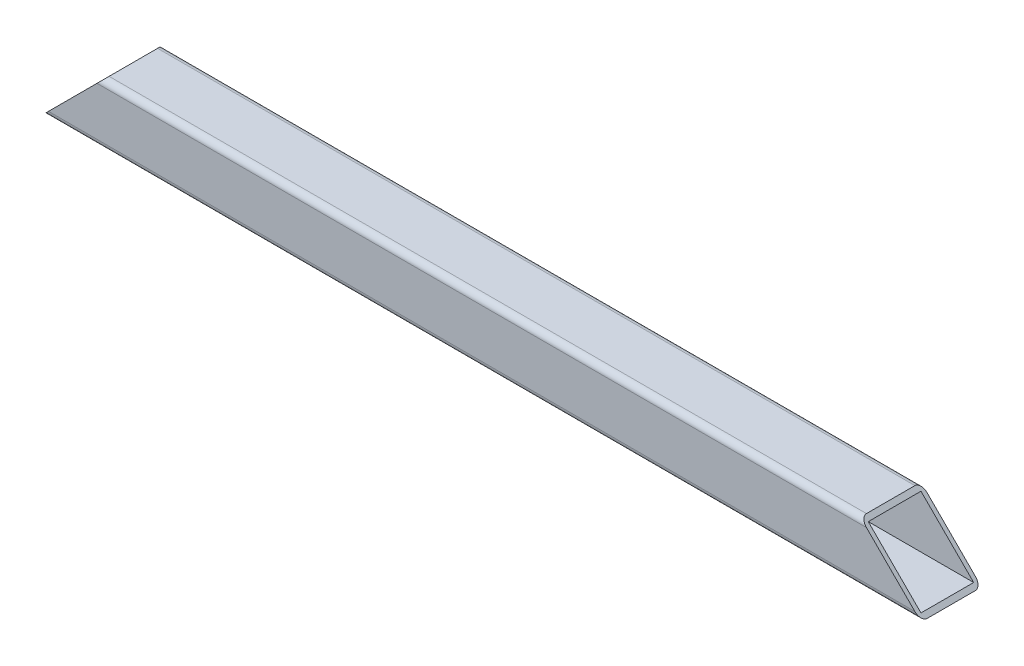
ISO-10303-21;
HEADER;
FILE_DESCRIPTION(('STEP AP214'),'2;1');
FILE_NAME('part.step','',(''),(''),'','','');
FILE_SCHEMA(('AUTOMOTIVE_DESIGN { 1 0 10303 214 1 1 1 1 }'));
ENDSEC;
DATA;
#1=APPLICATION_CONTEXT('core data for automotive mechanical design processes');
#2=APPLICATION_PROTOCOL_DEFINITION('international standard','automotive_design',2000,#1);
#3=PRODUCT_CONTEXT('',#1,'mechanical');
#4=PRODUCT('Part','Part','',(#3));
#5=PRODUCT_RELATED_PRODUCT_CATEGORY('part','',(#4));
#6=PRODUCT_DEFINITION_FORMATION('','',#4);
#7=PRODUCT_DEFINITION_CONTEXT('part definition',#1,'design');
#8=PRODUCT_DEFINITION('design','',#6,#7);
#9=PRODUCT_DEFINITION_SHAPE('','',#8);
#10=(LENGTH_UNIT() NAMED_UNIT(*) SI_UNIT(.MILLI.,.METRE.));
#11=(NAMED_UNIT(*) PLANE_ANGLE_UNIT() SI_UNIT($,.RADIAN.));
#12=(NAMED_UNIT(*) SI_UNIT($,.STERADIAN.) SOLID_ANGLE_UNIT());
#13=UNCERTAINTY_MEASURE_WITH_UNIT(LENGTH_MEASURE(1.E-05),#10,'distance_accuracy_value','');
#14=(GEOMETRIC_REPRESENTATION_CONTEXT(3) GLOBAL_UNCERTAINTY_ASSIGNED_CONTEXT((#13)) GLOBAL_UNIT_ASSIGNED_CONTEXT((#10,
#11,#12)) REPRESENTATION_CONTEXT('',''));
#15=CARTESIAN_POINT('',(0.,0.,0.));
#16=DIRECTION('',(0.,0.,1.));
#17=DIRECTION('',(1.,0.,0.));
#18=AXIS2_PLACEMENT_3D('',#15,#16,#17);
#19=CARTESIAN_POINT('',(-171.45,157.226,1427.861));
#20=DIRECTION('',(0.,-1.,0.));
#21=DIRECTION('',(0.,0.,-1.));
#22=AXIS2_PLACEMENT_3D('',#19,#20,#21);
#23=PLANE('',#22);
#24=DIRECTION('',(0.,0.,-1.));
#25=VECTOR('',#24,1.);
#26=CARTESIAN_POINT('',(-158.75,157.226,1427.861));
#27=LINE('',#26,#25);
#28=CARTESIAN_POINT('',(-158.75,157.226,1450.721));
#29=VERTEX_POINT('',#28);
#30=CARTESIAN_POINT('',(-158.75,157.226,1430.401));
#31=VERTEX_POINT('',#30);
#32=EDGE_CURVE('E256',#29,#31,#27,.T.);
#33=ORIENTED_EDGE('',*,*,#32,.F.);
#34=DIRECTION('',(1.,0.,0.));
#35=VECTOR('',#34,1.);
#36=CARTESIAN_POINT('',(-171.45,157.226,1450.721));
#37=LINE('',#36,#35);
#38=CARTESIAN_POINT('',(158.75,157.226,1450.721));
#39=VERTEX_POINT('',#38);
#40=EDGE_CURVE('E11',#29,#39,#37,.T.);
#41=ORIENTED_EDGE('',*,*,#40,.T.);
#42=DIRECTION('',(0.,0.,1.));
#43=VECTOR('',#42,1.);
#44=CARTESIAN_POINT('',(158.75,157.226,1427.861));
#45=LINE('',#44,#43);
#46=CARTESIAN_POINT('',(158.75,157.226,1430.401));
#47=VERTEX_POINT('',#46);
#48=EDGE_CURVE('E172',#47,#39,#45,.T.);
#49=ORIENTED_EDGE('',*,*,#48,.F.);
#50=DIRECTION('',(1.,0.,0.));
#51=VECTOR('',#50,1.);
#52=CARTESIAN_POINT('',(-171.45,157.226,1430.401));
#53=LINE('',#52,#51);
#54=EDGE_CURVE('E52',#47,#31,#53,.F.);
#55=ORIENTED_EDGE('',*,*,#54,.T.);
#56=EDGE_LOOP('',(#33,#41,#49,#55));
#57=FACE_BOUND('',#56,.T.);
#58=ADVANCED_FACE('F43',(#57),#23,.F.);
#59=CARTESIAN_POINT('',(-171.45,131.826,1427.861));
#60=DIRECTION('',(0.,0.,1.));
#61=DIRECTION('',(1.,0.,0.));
#62=AXIS2_PLACEMENT_3D('',#59,#60,#61);
#63=PLANE('',#62);
#64=DIRECTION('',(-0.707106781186548,0.707106781186548,0.));
#65=VECTOR('',#64,1.);
#66=CARTESIAN_POINT('',(6.34999999999997,309.626,1427.861));
#67=LINE('',#66,#65);
#68=CARTESIAN_POINT('',(181.61,134.366,1427.861));
#69=VERTEX_POINT('',#68);
#70=CARTESIAN_POINT('',(161.29,154.686,1427.861));
#71=VERTEX_POINT('',#70);
#72=EDGE_CURVE('E177',#69,#71,#67,.T.);
#73=ORIENTED_EDGE('',*,*,#72,.F.);
#74=DIRECTION('',(1.,0.,0.));
#75=VECTOR('',#74,1.);
#76=CARTESIAN_POINT('',(-171.45,134.366,1427.861));
#77=LINE('',#76,#75);
#78=CARTESIAN_POINT('',(-181.61,134.366,1427.861));
#79=VERTEX_POINT('',#78);
#80=EDGE_CURVE('E225',#69,#79,#77,.F.);
#81=ORIENTED_EDGE('',*,*,#80,.T.);
#82=DIRECTION('',(-0.707106781186547,-0.707106781186548,0.));
#83=VECTOR('',#82,1.);
#84=CARTESIAN_POINT('',(-177.8,138.176,1427.861));
#85=LINE('',#84,#83);
#86=CARTESIAN_POINT('',(-161.29,154.686,1427.861));
#87=VERTEX_POINT('',#86);
#88=EDGE_CURVE('E252',#87,#79,#85,.T.);
#89=ORIENTED_EDGE('',*,*,#88,.F.);
#90=DIRECTION('',(1.,0.,0.));
#91=VECTOR('',#90,1.);
#92=CARTESIAN_POINT('',(-171.45,154.686,1427.861));
#93=LINE('',#92,#91);
#94=EDGE_CURVE('E221',#87,#71,#93,.T.);
#95=ORIENTED_EDGE('',*,*,#94,.T.);
#96=EDGE_LOOP('',(#73,#81,#89,#95));
#97=FACE_BOUND('',#96,.T.);
#98=ADVANCED_FACE('F292',(#97),#63,.F.);
#99=CARTESIAN_POINT('',(-171.45,131.826,1427.861));
#100=DIRECTION('',(0.,1.,0.));
#101=DIRECTION('',(0.,0.,1.));
#102=AXIS2_PLACEMENT_3D('',#99,#100,#101);
#103=PLANE('',#102);
#104=DIRECTION('',(0.,0.,1.));
#105=VECTOR('',#104,1.);
#106=CARTESIAN_POINT('',(-184.15,131.826,1427.861));
#107=LINE('',#106,#105);
#108=CARTESIAN_POINT('',(-184.15,131.826,1430.401));
#109=VERTEX_POINT('',#108);
#110=CARTESIAN_POINT('',(-184.15,131.826,1450.721));
#111=VERTEX_POINT('',#110);
#112=EDGE_CURVE('E181',#109,#111,#107,.T.);
#113=ORIENTED_EDGE('',*,*,#112,.F.);
#114=DIRECTION('',(1.,0.,0.));
#115=VECTOR('',#114,1.);
#116=CARTESIAN_POINT('',(-171.45,131.826,1430.401));
#117=LINE('',#116,#115);
#118=CARTESIAN_POINT('',(184.15,131.826,1430.401));
#119=VERTEX_POINT('',#118);
#120=EDGE_CURVE('E205',#109,#119,#117,.T.);
#121=ORIENTED_EDGE('',*,*,#120,.T.);
#122=DIRECTION('',(0.,0.,-1.));
#123=VECTOR('',#122,1.);
#124=CARTESIAN_POINT('',(184.15,131.826,1427.861));
#125=LINE('',#124,#123);
#126=CARTESIAN_POINT('',(184.15,131.826,1450.721));
#127=VERTEX_POINT('',#126);
#128=EDGE_CURVE('E182',#127,#119,#125,.T.);
#129=ORIENTED_EDGE('',*,*,#128,.F.);
#130=DIRECTION('',(1.,0.,0.));
#131=VECTOR('',#130,1.);
#132=CARTESIAN_POINT('',(-171.45,131.826,1450.721));
#133=LINE('',#132,#131);
#134=EDGE_CURVE('E185',#127,#111,#133,.F.);
#135=ORIENTED_EDGE('',*,*,#134,.T.);
#136=EDGE_LOOP('',(#113,#121,#129,#135));
#137=FACE_BOUND('',#136,.T.);
#138=ADVANCED_FACE('F298',(#137),#103,.F.);
#139=CARTESIAN_POINT('',(-171.45,155.575,1429.512));
#140=DIRECTION('',(0.,-1.,0.));
#141=DIRECTION('',(0.,0.,-1.));
#142=AXIS2_PLACEMENT_3D('',#139,#140,#141);
#143=PLANE('',#142);
#144=DIRECTION('',(1.,0.,0.));
#145=VECTOR('',#144,1.);
#146=CARTESIAN_POINT('',(-171.45,155.575,1429.512));
#147=LINE('',#146,#145);
#148=CARTESIAN_POINT('',(-160.401,155.575,1429.512));
#149=VERTEX_POINT('',#148);
#150=CARTESIAN_POINT('',(160.401,155.575,1429.512));
#151=VERTEX_POINT('',#150);
#152=EDGE_CURVE('E147',#149,#151,#147,.T.);
#153=ORIENTED_EDGE('',*,*,#152,.T.);
#154=DIRECTION('',(0.,0.,1.));
#155=VECTOR('',#154,1.);
#156=CARTESIAN_POINT('',(160.401,155.575,1429.512));
#157=LINE('',#156,#155);
#158=CARTESIAN_POINT('',(160.401,155.575,1451.61));
#159=VERTEX_POINT('',#158);
#160=EDGE_CURVE('E133',#151,#159,#157,.T.);
#161=ORIENTED_EDGE('',*,*,#160,.T.);
#162=DIRECTION('',(1.,0.,0.));
#163=VECTOR('',#162,1.);
#164=CARTESIAN_POINT('',(-171.45,155.575,1451.61));
#165=LINE('',#164,#163);
#166=CARTESIAN_POINT('',(-160.401,155.575,1451.61));
#167=VERTEX_POINT('',#166);
#168=EDGE_CURVE('E190',#167,#159,#165,.T.);
#169=ORIENTED_EDGE('',*,*,#168,.F.);
#170=DIRECTION('',(0.,0.,-1.));
#171=VECTOR('',#170,1.);
#172=CARTESIAN_POINT('',(-160.401,155.575,1429.512));
#173=LINE('',#172,#171);
#174=EDGE_CURVE('E146',#167,#149,#173,.T.);
#175=ORIENTED_EDGE('',*,*,#174,.T.);
#176=EDGE_LOOP('',(#153,#161,#169,#175));
#177=FACE_BOUND('',#176,.T.);
#178=ADVANCED_FACE('F151',(#177),#143,.T.);
#179=CARTESIAN_POINT('',(-171.45,133.477,1451.61));
#180=DIRECTION('',(0.,0.,-1.));
#181=DIRECTION('',(-1.,0.,0.));
#182=AXIS2_PLACEMENT_3D('',#179,#180,#181);
#183=PLANE('',#182);
#184=ORIENTED_EDGE('',*,*,#168,.T.);
#185=DIRECTION('',(0.707106781186548,-0.707106781186548,0.));
#186=VECTOR('',#185,1.);
#187=CARTESIAN_POINT('',(5.52449999999996,310.4515,1451.61));
#188=LINE('',#187,#186);
#189=CARTESIAN_POINT('',(182.499,133.477,1451.61));
#190=VERTEX_POINT('',#189);
#191=EDGE_CURVE('E141',#159,#190,#188,.T.);
#192=ORIENTED_EDGE('',*,*,#191,.T.);
#193=DIRECTION('',(1.,0.,0.));
#194=VECTOR('',#193,1.);
#195=CARTESIAN_POINT('',(-171.45,133.477,1451.61));
#196=LINE('',#195,#194);
#197=CARTESIAN_POINT('',(-182.499,133.477,1451.61));
#198=VERTEX_POINT('',#197);
#199=EDGE_CURVE('E194',#198,#190,#196,.T.);
#200=ORIENTED_EDGE('',*,*,#199,.F.);
#201=DIRECTION('',(0.707106781186547,0.707106781186548,0.));
#202=VECTOR('',#201,1.);
#203=CARTESIAN_POINT('',(-176.9745,139.0015,1451.61));
#204=LINE('',#203,#202);
#205=EDGE_CURVE('E189',#198,#167,#204,.T.);
#206=ORIENTED_EDGE('',*,*,#205,.T.);
#207=EDGE_LOOP('',(#184,#192,#200,#206));
#208=FACE_BOUND('',#207,.T.);
#209=ADVANCED_FACE('F276',(#208),#183,.T.);
#210=CARTESIAN_POINT('',(-171.45,133.477,1429.512));
#211=DIRECTION('',(0.,1.,0.));
#212=DIRECTION('',(0.,0.,1.));
#213=AXIS2_PLACEMENT_3D('',#210,#211,#212);
#214=PLANE('',#213);
#215=ORIENTED_EDGE('',*,*,#199,.T.);
#216=DIRECTION('',(0.,0.,-1.));
#217=VECTOR('',#216,1.);
#218=CARTESIAN_POINT('',(182.499,133.477,1429.512));
#219=LINE('',#218,#217);
#220=CARTESIAN_POINT('',(182.499,133.477,1429.512));
#221=VERTEX_POINT('',#220);
#222=EDGE_CURVE('E191',#190,#221,#219,.T.);
#223=ORIENTED_EDGE('',*,*,#222,.T.);
#224=DIRECTION('',(1.,0.,0.));
#225=VECTOR('',#224,1.);
#226=CARTESIAN_POINT('',(-171.45,133.477,1429.512));
#227=LINE('',#226,#225);
#228=CARTESIAN_POINT('',(-182.499,133.477,1429.512));
#229=VERTEX_POINT('',#228);
#230=EDGE_CURVE('E159',#229,#221,#227,.T.);
#231=ORIENTED_EDGE('',*,*,#230,.F.);
#232=DIRECTION('',(0.,0.,1.));
#233=VECTOR('',#232,1.);
#234=CARTESIAN_POINT('',(-182.499,133.477,1429.512));
#235=LINE('',#234,#233);
#236=EDGE_CURVE('E168',#229,#198,#235,.T.);
#237=ORIENTED_EDGE('',*,*,#236,.T.);
#238=EDGE_LOOP('',(#215,#223,#231,#237));
#239=FACE_BOUND('',#238,.T.);
#240=ADVANCED_FACE('F280',(#239),#214,.T.);
#241=CARTESIAN_POINT('',(-171.45,133.477,1429.512));
#242=DIRECTION('',(0.,0.,1.));
#243=DIRECTION('',(1.,0.,0.));
#244=AXIS2_PLACEMENT_3D('',#241,#242,#243);
#245=PLANE('',#244);
#246=ORIENTED_EDGE('',*,*,#230,.T.);
#247=DIRECTION('',(-0.707106781186548,0.707106781186548,0.));
#248=VECTOR('',#247,1.);
#249=CARTESIAN_POINT('',(5.52449999999996,310.4515,1429.512));
#250=LINE('',#249,#248);
#251=EDGE_CURVE('E138',#221,#151,#250,.T.);
#252=ORIENTED_EDGE('',*,*,#251,.T.);
#253=ORIENTED_EDGE('',*,*,#152,.F.);
#254=DIRECTION('',(-0.707106781186547,-0.707106781186548,0.));
#255=VECTOR('',#254,1.);
#256=CARTESIAN_POINT('',(-176.9745,139.0015,1429.512));
#257=LINE('',#256,#255);
#258=EDGE_CURVE('E161',#149,#229,#257,.T.);
#259=ORIENTED_EDGE('',*,*,#258,.T.);
#260=EDGE_LOOP('',(#246,#252,#253,#259));
#261=FACE_BOUND('',#260,.T.);
#262=ADVANCED_FACE('F157',(#261),#245,.T.);
#263=CARTESIAN_POINT('',(-171.45,131.826,1453.261));
#264=DIRECTION('',(0.,0.,-1.));
#265=DIRECTION('',(-1.,0.,0.));
#266=AXIS2_PLACEMENT_3D('',#263,#264,#265);
#267=PLANE('',#266);
#268=DIRECTION('',(0.707106781186547,0.707106781186548,0.));
#269=VECTOR('',#268,1.);
#270=CARTESIAN_POINT('',(-177.8,138.176,1453.261));
#271=LINE('',#270,#269);
#272=CARTESIAN_POINT('',(-181.61,134.366,1453.261));
#273=VERTEX_POINT('',#272);
#274=CARTESIAN_POINT('',(-161.29,154.686,1453.261));
#275=VERTEX_POINT('',#274);
#276=EDGE_CURVE('E165',#273,#275,#271,.T.);
#277=ORIENTED_EDGE('',*,*,#276,.F.);
#278=DIRECTION('',(1.,0.,0.));
#279=VECTOR('',#278,1.);
#280=CARTESIAN_POINT('',(-171.45,134.366,1453.261));
#281=LINE('',#280,#279);
#282=CARTESIAN_POINT('',(181.61,134.366,1453.261));
#283=VERTEX_POINT('',#282);
#284=EDGE_CURVE('E242',#273,#283,#281,.T.);
#285=ORIENTED_EDGE('',*,*,#284,.T.);
#286=DIRECTION('',(0.707106781186548,-0.707106781186548,0.));
#287=VECTOR('',#286,1.);
#288=CARTESIAN_POINT('',(6.34999999999997,309.626,1453.261));
#289=LINE('',#288,#287);
#290=CARTESIAN_POINT('',(161.29,154.686,1453.261));
#291=VERTEX_POINT('',#290);
#292=EDGE_CURVE('E176',#291,#283,#289,.T.);
#293=ORIENTED_EDGE('',*,*,#292,.F.);
#294=DIRECTION('',(1.,0.,0.));
#295=VECTOR('',#294,1.);
#296=CARTESIAN_POINT('',(-171.45,154.686,1453.261));
#297=LINE('',#296,#295);
#298=EDGE_CURVE('E239',#291,#275,#297,.F.);
#299=ORIENTED_EDGE('',*,*,#298,.T.);
#300=EDGE_LOOP('',(#277,#285,#293,#299));
#301=FACE_BOUND('',#300,.T.);
#302=ADVANCED_FACE('F288',(#301),#267,.F.);
#303=CARTESIAN_POINT('',(-171.45,144.526,1440.561));
#304=DIRECTION('',(-0.707106781186548,0.707106781186548,0.));
#305=DIRECTION('',(-0.707106781186547,-0.707106781186548,0.));
#306=AXIS2_PLACEMENT_3D('',#303,#304,#305);
#307=PLANE('',#306);
#308=ORIENTED_EDGE('',*,*,#174,.F.);
#309=ORIENTED_EDGE('',*,*,#205,.F.);
#310=ORIENTED_EDGE('',*,*,#236,.F.);
#311=ORIENTED_EDGE('',*,*,#258,.F.);
#312=EDGE_LOOP('',(#308,#309,#310,#311));
#313=FACE_BOUND('',#312,.T.);
#314=ORIENTED_EDGE('',*,*,#88,.T.);
#315=CARTESIAN_POINT('',(-181.61,134.366,1430.401));
#316=DIRECTION('',(-0.707106781186548,0.707106781186548,0.));
#317=DIRECTION('',(0.707106781186547,0.707106781186548,0.));
#318=AXIS2_PLACEMENT_3D('',#315,#316,#317);
#319=ELLIPSE('',#318,3.59210244842766,2.54);
#320=EDGE_CURVE('E236',#79,#109,#319,.T.);
#321=ORIENTED_EDGE('',*,*,#320,.T.);
#322=ORIENTED_EDGE('',*,*,#112,.T.);
#323=CARTESIAN_POINT('',(-181.61,134.366,1450.721));
#324=DIRECTION('',(-0.707106781186548,0.707106781186548,0.));
#325=DIRECTION('',(0.707106781186547,0.707106781186548,0.));
#326=AXIS2_PLACEMENT_3D('',#323,#324,#325);
#327=ELLIPSE('',#326,3.59210244842766,2.54);
#328=EDGE_CURVE('E233',#111,#273,#327,.T.);
#329=ORIENTED_EDGE('',*,*,#328,.T.);
#330=ORIENTED_EDGE('',*,*,#276,.T.);
#331=CARTESIAN_POINT('',(-161.29,154.686,1450.721));
#332=DIRECTION('',(-0.707106781186548,0.707106781186548,0.));
#333=DIRECTION('',(0.707106781186547,0.707106781186548,0.));
#334=AXIS2_PLACEMENT_3D('',#331,#332,#333);
#335=ELLIPSE('',#334,3.59210244842766,2.54);
#336=EDGE_CURVE('E65',#275,#29,#335,.T.);
#337=ORIENTED_EDGE('',*,*,#336,.T.);
#338=ORIENTED_EDGE('',*,*,#32,.T.);
#339=CARTESIAN_POINT('',(-161.29,154.686,1430.401));
#340=DIRECTION('',(-0.707106781186548,0.707106781186548,0.));
#341=DIRECTION('',(0.707106781186547,0.707106781186548,0.));
#342=AXIS2_PLACEMENT_3D('',#339,#340,#341);
#343=ELLIPSE('',#342,3.59210244842766,2.54);
#344=EDGE_CURVE('E228',#31,#87,#343,.T.);
#345=ORIENTED_EDGE('',*,*,#344,.T.);
#346=EDGE_LOOP('',(#314,#321,#322,#329,#330,#337,#338,#345));
#347=FACE_BOUND('',#346,.T.);
#348=ADVANCED_FACE('F278',(#313,#347),#307,.T.);
#349=CARTESIAN_POINT('',(171.45,144.526,1440.561));
#350=DIRECTION('',(0.707106781186547,0.707106781186548,0.));
#351=DIRECTION('',(-0.707106781186548,0.707106781186548,0.));
#352=AXIS2_PLACEMENT_3D('',#349,#350,#351);
#353=PLANE('',#352);
#354=ORIENTED_EDGE('',*,*,#160,.F.);
#355=ORIENTED_EDGE('',*,*,#251,.F.);
#356=ORIENTED_EDGE('',*,*,#222,.F.);
#357=ORIENTED_EDGE('',*,*,#191,.F.);
#358=EDGE_LOOP('',(#354,#355,#356,#357));
#359=FACE_BOUND('',#358,.T.);
#360=ORIENTED_EDGE('',*,*,#128,.T.);
#361=CARTESIAN_POINT('',(181.61,134.366,1430.401));
#362=DIRECTION('',(0.707106781186547,0.707106781186548,0.));
#363=DIRECTION('',(0.707106781186548,-0.707106781186548,0.));
#364=AXIS2_PLACEMENT_3D('',#361,#362,#363);
#365=ELLIPSE('',#364,3.59210244842766,2.54);
#366=EDGE_CURVE('E218',#119,#69,#365,.T.);
#367=ORIENTED_EDGE('',*,*,#366,.T.);
#368=ORIENTED_EDGE('',*,*,#72,.T.);
#369=CARTESIAN_POINT('',(161.29,154.686,1430.401));
#370=DIRECTION('',(0.707106781186547,0.707106781186548,0.));
#371=DIRECTION('',(0.707106781186548,-0.707106781186548,0.));
#372=AXIS2_PLACEMENT_3D('',#369,#370,#371);
#373=ELLIPSE('',#372,3.59210244842766,2.54);
#374=EDGE_CURVE('E209',#71,#47,#373,.T.);
#375=ORIENTED_EDGE('',*,*,#374,.T.);
#376=ORIENTED_EDGE('',*,*,#48,.T.);
#377=CARTESIAN_POINT('',(161.29,154.686,1450.721));
#378=DIRECTION('',(0.707106781186547,0.707106781186548,0.));
#379=DIRECTION('',(0.707106781186548,-0.707106781186548,0.));
#380=AXIS2_PLACEMENT_3D('',#377,#378,#379);
#381=ELLIPSE('',#380,3.59210244842766,2.54);
#382=EDGE_CURVE('E212',#39,#291,#381,.T.);
#383=ORIENTED_EDGE('',*,*,#382,.T.);
#384=ORIENTED_EDGE('',*,*,#292,.T.);
#385=CARTESIAN_POINT('',(181.61,134.366,1450.721));
#386=DIRECTION('',(0.707106781186547,0.707106781186548,0.));
#387=DIRECTION('',(0.707106781186548,-0.707106781186548,0.));
#388=AXIS2_PLACEMENT_3D('',#385,#386,#387);
#389=ELLIPSE('',#388,3.59210244842766,2.54);
#390=EDGE_CURVE('E215',#283,#127,#389,.T.);
#391=ORIENTED_EDGE('',*,*,#390,.T.);
#392=EDGE_LOOP('',(#360,#367,#368,#375,#376,#383,#384,#391));
#393=FACE_BOUND('',#392,.T.);
#394=ADVANCED_FACE('F135',(#359,#393),#353,.T.);
#395=CARTESIAN_POINT('',(-171.45,134.366,1430.401));
#396=DIRECTION('',(1.,0.,0.));
#397=DIRECTION('',(0.,0.,-1.));
#398=AXIS2_PLACEMENT_3D('',#395,#396,#397);
#399=CYLINDRICAL_SURFACE('',#398,2.54);
#400=ORIENTED_EDGE('',*,*,#320,.F.);
#401=ORIENTED_EDGE('',*,*,#80,.F.);
#402=ORIENTED_EDGE('',*,*,#366,.F.);
#403=ORIENTED_EDGE('',*,*,#120,.F.);
#404=EDGE_LOOP('',(#400,#401,#402,#403));
#405=FACE_BOUND('',#404,.T.);
#406=ADVANCED_FACE('F305',(#405),#399,.T.);
#407=CARTESIAN_POINT('',(-171.45,134.366,1450.721));
#408=DIRECTION('',(1.,0.,0.));
#409=DIRECTION('',(0.,0.,-1.));
#410=AXIS2_PLACEMENT_3D('',#407,#408,#409);
#411=CYLINDRICAL_SURFACE('',#410,2.54);
#412=ORIENTED_EDGE('',*,*,#328,.F.);
#413=ORIENTED_EDGE('',*,*,#134,.F.);
#414=ORIENTED_EDGE('',*,*,#390,.F.);
#415=ORIENTED_EDGE('',*,*,#284,.F.);
#416=EDGE_LOOP('',(#412,#413,#414,#415));
#417=FACE_BOUND('',#416,.T.);
#418=ADVANCED_FACE('F308',(#417),#411,.T.);
#419=CARTESIAN_POINT('',(-171.45,154.686,1450.721));
#420=DIRECTION('',(1.,0.,0.));
#421=DIRECTION('',(0.,0.,-1.));
#422=AXIS2_PLACEMENT_3D('',#419,#420,#421);
#423=CYLINDRICAL_SURFACE('',#422,2.54);
#424=ORIENTED_EDGE('',*,*,#336,.F.);
#425=ORIENTED_EDGE('',*,*,#298,.F.);
#426=ORIENTED_EDGE('',*,*,#382,.F.);
#427=ORIENTED_EDGE('',*,*,#40,.F.);
#428=EDGE_LOOP('',(#424,#425,#426,#427));
#429=FACE_BOUND('',#428,.T.);
#430=ADVANCED_FACE('F311',(#429),#423,.T.);
#431=CARTESIAN_POINT('',(-171.45,154.686,1430.401));
#432=DIRECTION('',(1.,0.,0.));
#433=DIRECTION('',(0.,0.,-1.));
#434=AXIS2_PLACEMENT_3D('',#431,#432,#433);
#435=CYLINDRICAL_SURFACE('',#434,2.54);
#436=ORIENTED_EDGE('',*,*,#344,.F.);
#437=ORIENTED_EDGE('',*,*,#54,.F.);
#438=ORIENTED_EDGE('',*,*,#374,.F.);
#439=ORIENTED_EDGE('',*,*,#94,.F.);
#440=EDGE_LOOP('',(#436,#437,#438,#439));
#441=FACE_BOUND('',#440,.T.);
#442=ADVANCED_FACE('F45',(#441),#435,.T.);
#443=CLOSED_SHELL('',(#58,#98,#138,#178,#209,#240,#262,#302,#348,#394,#406,#418,#430,#442));
#444=MANIFOLD_SOLID_BREP('B2',#443);
#445=ADVANCED_BREP_SHAPE_REPRESENTATION('',(#18,#444),#14);
#446=SHAPE_DEFINITION_REPRESENTATION(#9,#445);
ENDSEC;
END-ISO-10303-21;
